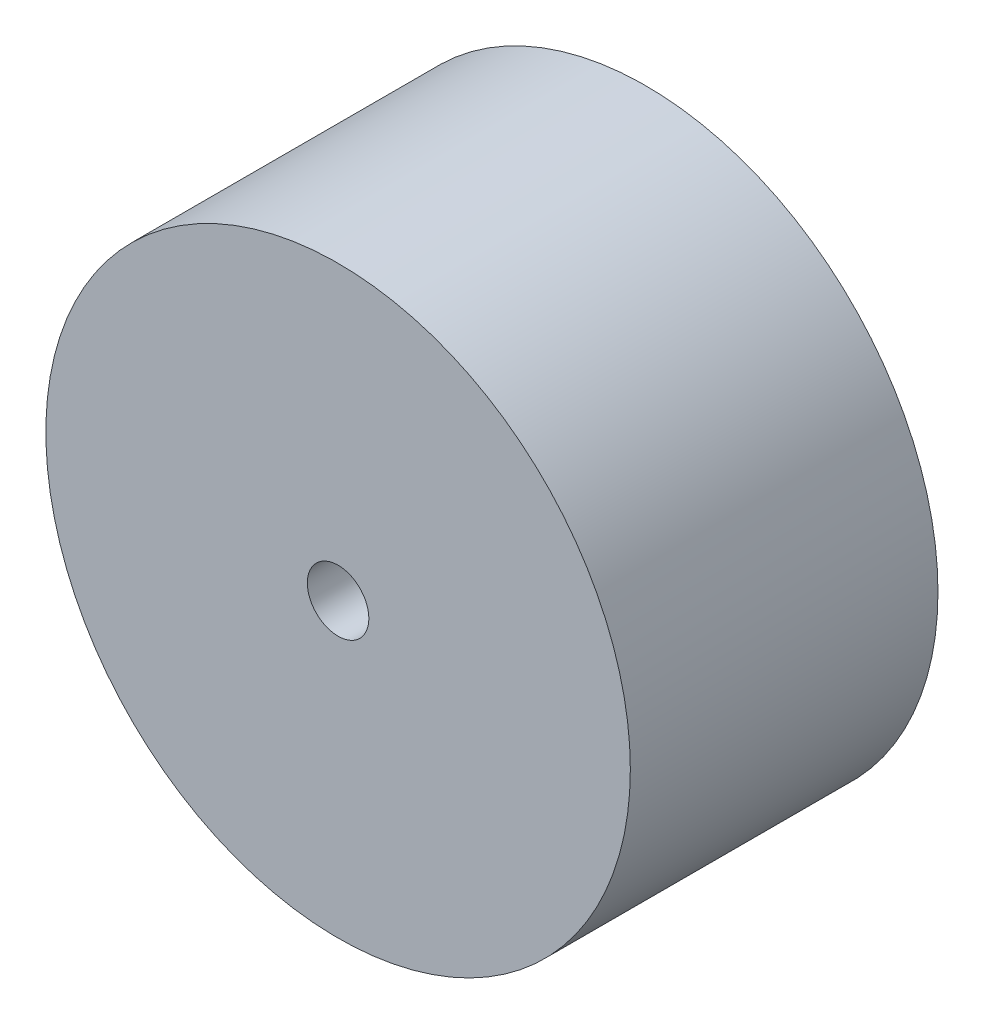
ISO-10303-21;
HEADER;
FILE_DESCRIPTION(('STEP AP214'),'2;1');
FILE_NAME('part.step','',(''),(''),'','','');
FILE_SCHEMA(('AUTOMOTIVE_DESIGN { 1 0 10303 214 1 1 1 1 }'));
ENDSEC;
DATA;
#1=APPLICATION_CONTEXT('core data for automotive mechanical design processes');
#2=APPLICATION_PROTOCOL_DEFINITION('international standard','automotive_design',2000,#1);
#3=PRODUCT_CONTEXT('',#1,'mechanical');
#4=PRODUCT('Part','Part','',(#3));
#5=PRODUCT_RELATED_PRODUCT_CATEGORY('part','',(#4));
#6=PRODUCT_DEFINITION_FORMATION('','',#4);
#7=PRODUCT_DEFINITION_CONTEXT('part definition',#1,'design');
#8=PRODUCT_DEFINITION('design','',#6,#7);
#9=PRODUCT_DEFINITION_SHAPE('','',#8);
#10=(LENGTH_UNIT() NAMED_UNIT(*) SI_UNIT(.MILLI.,.METRE.));
#11=(NAMED_UNIT(*) PLANE_ANGLE_UNIT() SI_UNIT($,.RADIAN.));
#12=(NAMED_UNIT(*) SI_UNIT($,.STERADIAN.) SOLID_ANGLE_UNIT());
#13=UNCERTAINTY_MEASURE_WITH_UNIT(LENGTH_MEASURE(1.E-05),#10,'distance_accuracy_value','');
#14=(GEOMETRIC_REPRESENTATION_CONTEXT(3) GLOBAL_UNCERTAINTY_ASSIGNED_CONTEXT((#13)) GLOBAL_UNIT_ASSIGNED_CONTEXT((#10,
#11,#12)) REPRESENTATION_CONTEXT('',''));
#15=CARTESIAN_POINT('',(0.,0.,0.));
#16=DIRECTION('',(0.,0.,1.));
#17=DIRECTION('',(1.,0.,0.));
#18=AXIS2_PLACEMENT_3D('',#15,#16,#17);
#19=CARTESIAN_POINT('',(0.,0.,20.));
#20=DIRECTION('',(0.,0.,-1.));
#21=DIRECTION('',(-1.,0.,0.));
#22=AXIS2_PLACEMENT_3D('',#19,#20,#21);
#23=CYLINDRICAL_SURFACE('',#22,19.);
#24=CARTESIAN_POINT('',(0.,0.,20.));
#25=DIRECTION('',(0.,0.,1.));
#26=DIRECTION('',(1.,0.,0.));
#27=AXIS2_PLACEMENT_3D('',#24,#25,#26);
#28=CIRCLE('',#27,19.);
#29=CARTESIAN_POINT('',(19.,0.,20.));
#30=VERTEX_POINT('',#29);
#31=EDGE_CURVE('E10',#30,#30,#28,.T.);
#32=ORIENTED_EDGE('',*,*,#31,.F.);
#33=EDGE_LOOP('',(#32));
#34=FACE_BOUND('',#33,.T.);
#35=CARTESIAN_POINT('',(0.,0.,0.));
#36=DIRECTION('',(0.,0.,1.));
#37=DIRECTION('',(1.,0.,0.));
#38=AXIS2_PLACEMENT_3D('',#35,#36,#37);
#39=CIRCLE('',#38,19.);
#40=CARTESIAN_POINT('',(19.,0.,0.));
#41=VERTEX_POINT('',#40);
#42=EDGE_CURVE('E40',#41,#41,#39,.T.);
#43=ORIENTED_EDGE('',*,*,#42,.T.);
#44=EDGE_LOOP('',(#43));
#45=FACE_BOUND('',#44,.T.);
#46=ADVANCED_FACE('F37',(#34,#45),#23,.T.);
#47=CARTESIAN_POINT('',(0.,0.,20.));
#48=DIRECTION('',(0.,0.,1.));
#49=DIRECTION('',(1.,0.,0.));
#50=AXIS2_PLACEMENT_3D('',#47,#48,#49);
#51=PLANE('',#50);
#52=CARTESIAN_POINT('',(0.,0.,20.));
#53=DIRECTION('',(0.,0.,1.));
#54=DIRECTION('',(1.,0.,0.));
#55=AXIS2_PLACEMENT_3D('',#52,#53,#54);
#56=CIRCLE('',#55,2.);
#57=CARTESIAN_POINT('',(2.,0.,20.));
#58=VERTEX_POINT('',#57);
#59=EDGE_CURVE('E51',#58,#58,#56,.T.);
#60=ORIENTED_EDGE('',*,*,#59,.F.);
#61=EDGE_LOOP('',(#60));
#62=FACE_BOUND('',#61,.T.);
#63=ORIENTED_EDGE('',*,*,#31,.T.);
#64=EDGE_LOOP('',(#63));
#65=FACE_BOUND('',#64,.T.);
#66=ADVANCED_FACE('F68',(#62,#65),#51,.T.);
#67=CARTESIAN_POINT('',(0.,0.,0.));
#68=DIRECTION('',(0.,0.,1.));
#69=DIRECTION('',(1.,0.,0.));
#70=AXIS2_PLACEMENT_3D('',#67,#68,#69);
#71=PLANE('',#70);
#72=CARTESIAN_POINT('',(0.,0.,0.));
#73=DIRECTION('',(0.,0.,1.));
#74=DIRECTION('',(1.,0.,0.));
#75=AXIS2_PLACEMENT_3D('',#72,#73,#74);
#76=CIRCLE('',#75,2.);
#77=CARTESIAN_POINT('',(2.,0.,0.));
#78=VERTEX_POINT('',#77);
#79=EDGE_CURVE('E49',#78,#78,#76,.T.);
#80=ORIENTED_EDGE('',*,*,#79,.T.);
#81=EDGE_LOOP('',(#80));
#82=FACE_BOUND('',#81,.T.);
#83=ORIENTED_EDGE('',*,*,#42,.F.);
#84=EDGE_LOOP('',(#83));
#85=FACE_BOUND('',#84,.T.);
#86=ADVANCED_FACE('F59',(#82,#85),#71,.F.);
#87=CARTESIAN_POINT('',(0.,0.,0.));
#88=DIRECTION('',(0.,0.,1.));
#89=DIRECTION('',(1.,0.,0.));
#90=AXIS2_PLACEMENT_3D('',#87,#88,#89);
#91=CYLINDRICAL_SURFACE('',#90,2.);
#92=ORIENTED_EDGE('',*,*,#79,.F.);
#93=EDGE_LOOP('',(#92));
#94=FACE_BOUND('',#93,.T.);
#95=ORIENTED_EDGE('',*,*,#59,.T.);
#96=EDGE_LOOP('',(#95));
#97=FACE_BOUND('',#96,.T.);
#98=ADVANCED_FACE('F62',(#94,#97),#91,.F.);
#99=CLOSED_SHELL('',(#46,#66,#86,#98));
#100=MANIFOLD_SOLID_BREP('B2',#99);
#101=ADVANCED_BREP_SHAPE_REPRESENTATION('',(#18,#100),#14);
#102=SHAPE_DEFINITION_REPRESENTATION(#9,#101);
ENDSEC;
END-ISO-10303-21;
